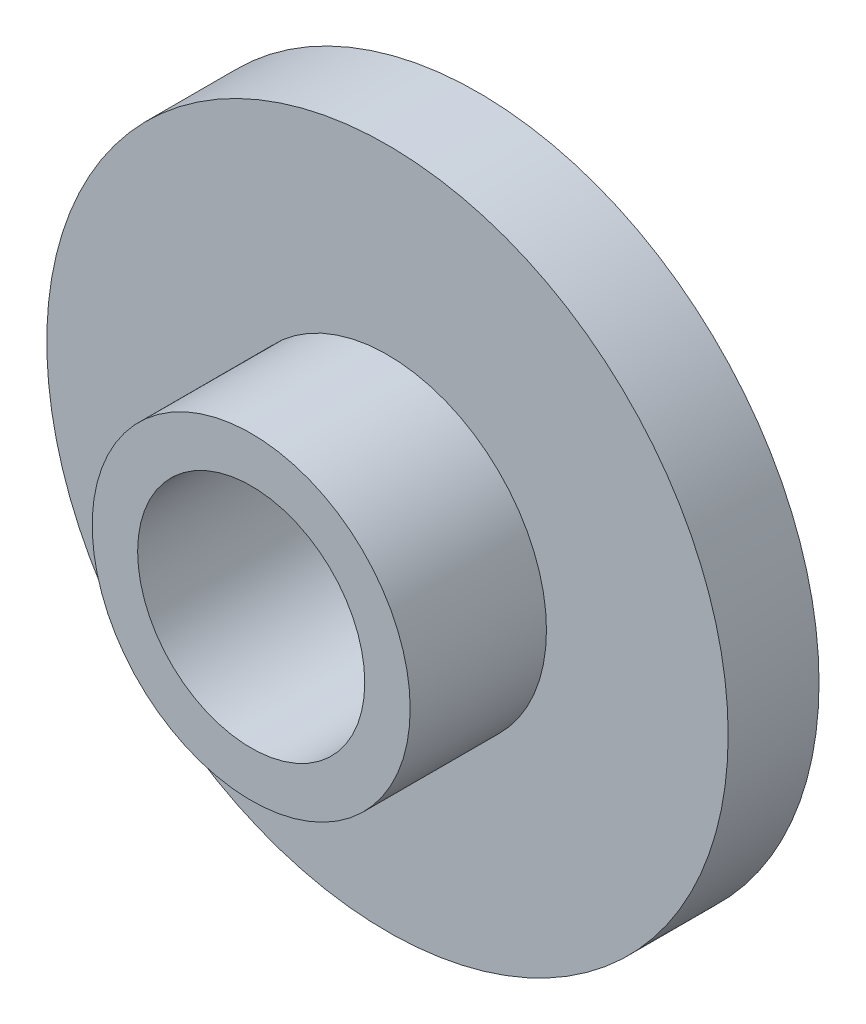
ISO-10303-21;
HEADER;
FILE_DESCRIPTION(('STEP AP214'),'2;1');
FILE_NAME('part.step','',(''),(''),'','','');
FILE_SCHEMA(('AUTOMOTIVE_DESIGN { 1 0 10303 214 1 1 1 1 }'));
ENDSEC;
DATA;
#1=APPLICATION_CONTEXT('core data for automotive mechanical design processes');
#2=APPLICATION_PROTOCOL_DEFINITION('international standard','automotive_design',2000,#1);
#3=PRODUCT_CONTEXT('',#1,'mechanical');
#4=PRODUCT('Part','Part','',(#3));
#5=PRODUCT_RELATED_PRODUCT_CATEGORY('part','',(#4));
#6=PRODUCT_DEFINITION_FORMATION('','',#4);
#7=PRODUCT_DEFINITION_CONTEXT('part definition',#1,'design');
#8=PRODUCT_DEFINITION('design','',#6,#7);
#9=PRODUCT_DEFINITION_SHAPE('','',#8);
#10=(LENGTH_UNIT() NAMED_UNIT(*) SI_UNIT(.MILLI.,.METRE.));
#11=(NAMED_UNIT(*) PLANE_ANGLE_UNIT() SI_UNIT($,.RADIAN.));
#12=(NAMED_UNIT(*) SI_UNIT($,.STERADIAN.) SOLID_ANGLE_UNIT());
#13=UNCERTAINTY_MEASURE_WITH_UNIT(LENGTH_MEASURE(1.E-05),#10,'distance_accuracy_value','');
#14=(GEOMETRIC_REPRESENTATION_CONTEXT(3) GLOBAL_UNCERTAINTY_ASSIGNED_CONTEXT((#13)) GLOBAL_UNIT_ASSIGNED_CONTEXT((#10,
#11,#12)) REPRESENTATION_CONTEXT('',''));
#15=CARTESIAN_POINT('',(0.,0.,0.));
#16=DIRECTION('',(0.,0.,1.));
#17=DIRECTION('',(1.,0.,0.));
#18=AXIS2_PLACEMENT_3D('',#15,#16,#17);
#19=CARTESIAN_POINT('',(60.,0.,8.5));
#20=DIRECTION('',(0.,0.,1.));
#21=DIRECTION('',(1.,0.,0.));
#22=AXIS2_PLACEMENT_3D('',#19,#20,#21);
#23=PLANE('',#22);
#24=CARTESIAN_POINT('',(60.,0.,8.5));
#25=DIRECTION('',(0.,0.,1.));
#26=DIRECTION('',(1.,0.,0.));
#27=AXIS2_PLACEMENT_3D('',#24,#25,#26);
#28=CIRCLE('',#27,15.);
#29=CARTESIAN_POINT('',(75.,0.,8.5));
#30=VERTEX_POINT('',#29);
#31=EDGE_CURVE('E10',#30,#30,#28,.T.);
#32=ORIENTED_EDGE('',*,*,#31,.T.);
#33=EDGE_LOOP('',(#32));
#34=FACE_BOUND('',#33,.T.);
#35=CARTESIAN_POINT('',(60.,0.,8.5));
#36=DIRECTION('',(0.,0.,1.));
#37=DIRECTION('',(1.,0.,0.));
#38=AXIS2_PLACEMENT_3D('',#35,#36,#37);
#39=CIRCLE('',#38,7.);
#40=CARTESIAN_POINT('',(67.,0.,8.5));
#41=VERTEX_POINT('',#40);
#42=EDGE_CURVE('E52',#41,#41,#39,.T.);
#43=ORIENTED_EDGE('',*,*,#42,.F.);
#44=EDGE_LOOP('',(#43));
#45=FACE_BOUND('',#44,.T.);
#46=ADVANCED_FACE('F36',(#34,#45),#23,.T.);
#47=CARTESIAN_POINT('',(60.,0.,4.5));
#48=DIRECTION('',(0.,0.,1.));
#49=DIRECTION('',(1.,0.,0.));
#50=AXIS2_PLACEMENT_3D('',#47,#48,#49);
#51=PLANE('',#50);
#52=CARTESIAN_POINT('',(60.,0.,4.5));
#53=DIRECTION('',(0.,0.,1.));
#54=DIRECTION('',(1.,0.,0.));
#55=AXIS2_PLACEMENT_3D('',#52,#53,#54);
#56=CIRCLE('',#55,15.);
#57=CARTESIAN_POINT('',(75.,0.,4.5));
#58=VERTEX_POINT('',#57);
#59=EDGE_CURVE('E40',#58,#58,#56,.T.);
#60=ORIENTED_EDGE('',*,*,#59,.F.);
#61=EDGE_LOOP('',(#60));
#62=FACE_BOUND('',#61,.T.);
#63=CARTESIAN_POINT('',(60.,0.,4.5));
#64=DIRECTION('',(0.,0.,1.));
#65=DIRECTION('',(1.,0.,0.));
#66=AXIS2_PLACEMENT_3D('',#63,#64,#65);
#67=CIRCLE('',#66,5.);
#68=CARTESIAN_POINT('',(65.,0.,4.5));
#69=VERTEX_POINT('',#68);
#70=EDGE_CURVE('E47',#69,#69,#67,.T.);
#71=ORIENTED_EDGE('',*,*,#70,.T.);
#72=EDGE_LOOP('',(#71));
#73=FACE_BOUND('',#72,.T.);
#74=ADVANCED_FACE('F77',(#62,#73),#51,.F.);
#75=CARTESIAN_POINT('',(60.,0.,8.5));
#76=DIRECTION('',(0.,0.,-1.));
#77=DIRECTION('',(-1.,0.,0.));
#78=AXIS2_PLACEMENT_3D('',#75,#76,#77);
#79=CYLINDRICAL_SURFACE('',#78,15.);
#80=ORIENTED_EDGE('',*,*,#31,.F.);
#81=EDGE_LOOP('',(#80));
#82=FACE_BOUND('',#81,.T.);
#83=ORIENTED_EDGE('',*,*,#59,.T.);
#84=EDGE_LOOP('',(#83));
#85=FACE_BOUND('',#84,.T.);
#86=ADVANCED_FACE('F38',(#82,#85),#79,.T.);
#87=CARTESIAN_POINT('',(60.,0.,8.5));
#88=DIRECTION('',(0.,0.,-1.));
#89=DIRECTION('',(-1.,0.,0.));
#90=AXIS2_PLACEMENT_3D('',#87,#88,#89);
#91=CYLINDRICAL_SURFACE('',#90,5.);
#92=ORIENTED_EDGE('',*,*,#70,.F.);
#93=EDGE_LOOP('',(#92));
#94=FACE_BOUND('',#93,.T.);
#95=CARTESIAN_POINT('',(60.,0.,14.5));
#96=DIRECTION('',(0.,0.,1.));
#97=DIRECTION('',(1.,0.,0.));
#98=AXIS2_PLACEMENT_3D('',#95,#96,#97);
#99=CIRCLE('',#98,5.);
#100=CARTESIAN_POINT('',(65.,0.,14.5));
#101=VERTEX_POINT('',#100);
#102=EDGE_CURVE('E55',#101,#101,#99,.T.);
#103=ORIENTED_EDGE('',*,*,#102,.T.);
#104=EDGE_LOOP('',(#103));
#105=FACE_BOUND('',#104,.T.);
#106=ADVANCED_FACE('F61',(#94,#105),#91,.F.);
#107=CARTESIAN_POINT('',(60.,0.,14.5));
#108=DIRECTION('',(0.,0.,1.));
#109=DIRECTION('',(1.,0.,0.));
#110=AXIS2_PLACEMENT_3D('',#107,#108,#109);
#111=PLANE('',#110);
#112=CARTESIAN_POINT('',(60.,0.,14.5));
#113=DIRECTION('',(0.,0.,1.));
#114=DIRECTION('',(1.,0.,0.));
#115=AXIS2_PLACEMENT_3D('',#112,#113,#114);
#116=CIRCLE('',#115,7.);
#117=CARTESIAN_POINT('',(67.,0.,14.5));
#118=VERTEX_POINT('',#117);
#119=EDGE_CURVE('E51',#118,#118,#116,.T.);
#120=ORIENTED_EDGE('',*,*,#119,.T.);
#121=EDGE_LOOP('',(#120));
#122=FACE_BOUND('',#121,.T.);
#123=ORIENTED_EDGE('',*,*,#102,.F.);
#124=EDGE_LOOP('',(#123));
#125=FACE_BOUND('',#124,.T.);
#126=ADVANCED_FACE('F63',(#122,#125),#111,.T.);
#127=CARTESIAN_POINT('',(60.,0.,14.5));
#128=DIRECTION('',(0.,0.,-1.));
#129=DIRECTION('',(-1.,0.,0.));
#130=AXIS2_PLACEMENT_3D('',#127,#128,#129);
#131=CYLINDRICAL_SURFACE('',#130,7.);
#132=ORIENTED_EDGE('',*,*,#119,.F.);
#133=EDGE_LOOP('',(#132));
#134=FACE_BOUND('',#133,.T.);
#135=ORIENTED_EDGE('',*,*,#42,.T.);
#136=EDGE_LOOP('',(#135));
#137=FACE_BOUND('',#136,.T.);
#138=ADVANCED_FACE('F65',(#134,#137),#131,.T.);
#139=CLOSED_SHELL('',(#46,#74,#86,#106,#126,#138));
#140=MANIFOLD_SOLID_BREP('B2',#139);
#141=ADVANCED_BREP_SHAPE_REPRESENTATION('',(#18,#140),#14);
#142=SHAPE_DEFINITION_REPRESENTATION(#9,#141);
ENDSEC;
END-ISO-10303-21;
